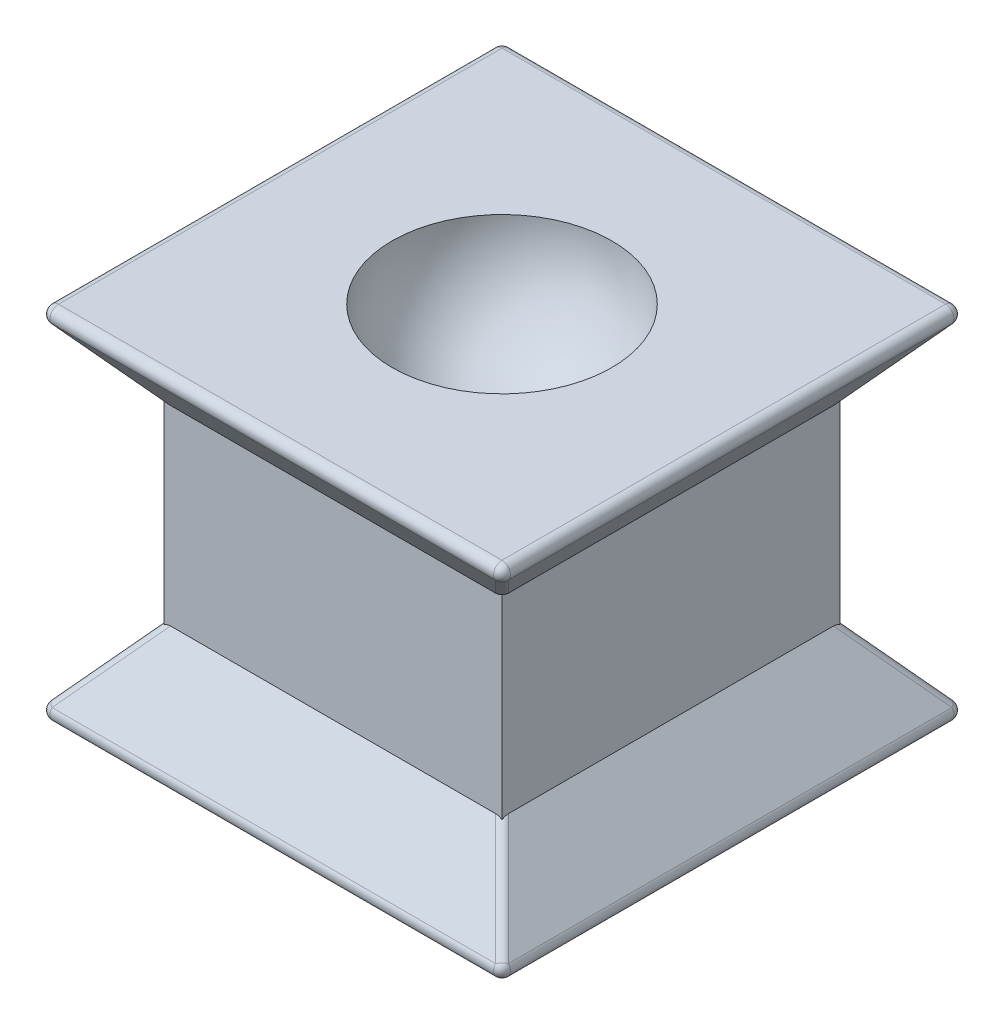
ISO-10303-21;
HEADER;
FILE_DESCRIPTION(('STEP AP214'),'2;1');
FILE_NAME('part.step','',(''),(''),'','','');
FILE_SCHEMA(('AUTOMOTIVE_DESIGN { 1 0 10303 214 1 1 1 1 }'));
ENDSEC;
DATA;
#1=APPLICATION_CONTEXT('core data for automotive mechanical design processes');
#2=APPLICATION_PROTOCOL_DEFINITION('international standard','automotive_design',2000,#1);
#3=PRODUCT_CONTEXT('',#1,'mechanical');
#4=PRODUCT('Part','Part','',(#3));
#5=PRODUCT_RELATED_PRODUCT_CATEGORY('part','',(#4));
#6=PRODUCT_DEFINITION_FORMATION('','',#4);
#7=PRODUCT_DEFINITION_CONTEXT('part definition',#1,'design');
#8=PRODUCT_DEFINITION('design','',#6,#7);
#9=PRODUCT_DEFINITION_SHAPE('','',#8);
#10=(LENGTH_UNIT() NAMED_UNIT(*) SI_UNIT(.MILLI.,.METRE.));
#11=(NAMED_UNIT(*) PLANE_ANGLE_UNIT() SI_UNIT($,.RADIAN.));
#12=(NAMED_UNIT(*) SI_UNIT($,.STERADIAN.) SOLID_ANGLE_UNIT());
#13=UNCERTAINTY_MEASURE_WITH_UNIT(LENGTH_MEASURE(1.E-05),#10,'distance_accuracy_value','');
#14=(GEOMETRIC_REPRESENTATION_CONTEXT(3) GLOBAL_UNCERTAINTY_ASSIGNED_CONTEXT((#13)) GLOBAL_UNIT_ASSIGNED_CONTEXT((#10,
#11,#12)) REPRESENTATION_CONTEXT('',''));
#15=CARTESIAN_POINT('',(0.,0.,0.));
#16=DIRECTION('',(0.,0.,1.));
#17=DIRECTION('',(1.,0.,0.));
#18=AXIS2_PLACEMENT_3D('',#15,#16,#17);
#19=CARTESIAN_POINT('',(25.4,14.351,25.4));
#20=DIRECTION('',(-1.,0.,0.));
#21=DIRECTION('',(0.,0.,1.));
#22=AXIS2_PLACEMENT_3D('',#19,#20,#21);
#23=PLANE('',#22);
#24=DIRECTION('',(0.,-1.,0.));
#25=VECTOR('',#24,1.);
#26=CARTESIAN_POINT('',(25.4,14.351,25.4));
#27=LINE('',#26,#25);
#28=CARTESIAN_POINT('',(25.4,14.665961599785,25.4));
#29=VERTEX_POINT('',#28);
#30=CARTESIAN_POINT('',(25.4,-14.665961599785,25.4));
#31=VERTEX_POINT('',#30);
#32=EDGE_CURVE('E475',#29,#31,#27,.T.);
#33=ORIENTED_EDGE('',*,*,#32,.T.);
#34=CARTESIAN_POINT('',(25.4,-16.3267692601127,25.4));
#35=DIRECTION('',(-1.,0.,0.));
#36=DIRECTION('',(0.,0.766044443118977,-0.64278760968654));
#37=AXIS2_PLACEMENT_3D('',#34,#35,#36);
#38=ELLIPSE('',#37,2.34873671772857,1.27);
#39=CARTESIAN_POINT('',(25.4,-14.351,24.4271235572389));
#40=VERTEX_POINT('',#39);
#41=EDGE_CURVE('E278',#31,#40,#38,.T.);
#42=ORIENTED_EDGE('',*,*,#41,.T.);
#43=DIRECTION('',(0.,0.,-1.));
#44=VECTOR('',#43,1.);
#45=CARTESIAN_POINT('',(25.4,-14.351,25.4));
#46=LINE('',#45,#44);
#47=CARTESIAN_POINT('',(25.4,-14.351,-24.4271235572389));
#48=VERTEX_POINT('',#47);
#49=EDGE_CURVE('E219',#40,#48,#46,.T.);
#50=ORIENTED_EDGE('',*,*,#49,.T.);
#51=CARTESIAN_POINT('',(25.4,-16.3267692601127,-25.4));
#52=DIRECTION('',(-1.,0.,0.));
#53=DIRECTION('',(0.,0.766044443118977,0.64278760968654));
#54=AXIS2_PLACEMENT_3D('',#51,#52,#53);
#55=ELLIPSE('',#54,2.34873671772857,1.27);
#56=CARTESIAN_POINT('',(25.4,-14.665961599785,-25.4));
#57=VERTEX_POINT('',#56);
#58=EDGE_CURVE('E208',#48,#57,#55,.T.);
#59=ORIENTED_EDGE('',*,*,#58,.T.);
#60=DIRECTION('',(0.,-1.,0.));
#61=VECTOR('',#60,1.);
#62=CARTESIAN_POINT('',(25.4,14.351,-25.4));
#63=LINE('',#62,#61);
#64=CARTESIAN_POINT('',(25.4,14.665961599785,-25.4));
#65=VERTEX_POINT('',#64);
#66=EDGE_CURVE('E202',#65,#57,#63,.T.);
#67=ORIENTED_EDGE('',*,*,#66,.F.);
#68=CARTESIAN_POINT('',(25.4,16.3267692601127,-25.4));
#69=DIRECTION('',(-1.,0.,0.));
#70=DIRECTION('',(0.,-0.766044443118977,0.64278760968654));
#71=AXIS2_PLACEMENT_3D('',#68,#69,#70);
#72=ELLIPSE('',#71,2.34873671772857,1.27);
#73=CARTESIAN_POINT('',(25.4,14.351,-24.4271235572389));
#74=VERTEX_POINT('',#73);
#75=EDGE_CURVE('E292',#65,#74,#72,.T.);
#76=ORIENTED_EDGE('',*,*,#75,.T.);
#77=DIRECTION('',(0.,0.,-1.));
#78=VECTOR('',#77,1.);
#79=CARTESIAN_POINT('',(25.4,14.351,25.4));
#80=LINE('',#79,#78);
#81=CARTESIAN_POINT('',(25.4,14.351,24.4271235572389));
#82=VERTEX_POINT('',#81);
#83=EDGE_CURVE('E461',#82,#74,#80,.T.);
#84=ORIENTED_EDGE('',*,*,#83,.F.);
#85=CARTESIAN_POINT('',(25.4,16.3267692601127,25.4));
#86=DIRECTION('',(-1.,0.,0.));
#87=DIRECTION('',(0.,-0.766044443118977,-0.64278760968654));
#88=AXIS2_PLACEMENT_3D('',#85,#86,#87);
#89=ELLIPSE('',#88,2.34873671772857,1.27);
#90=EDGE_CURVE('E294',#82,#29,#89,.T.);
#91=ORIENTED_EDGE('',*,*,#90,.T.);
#92=EDGE_LOOP('',(#33,#42,#50,#59,#67,#76,#84,#91));
#93=FACE_BOUND('',#92,.T.);
#94=ADVANCED_FACE('F35',(#93),#23,.F.);
#95=CARTESIAN_POINT('',(-25.4,14.351,-25.4));
#96=DIRECTION('',(0.,0.,1.));
#97=DIRECTION('',(1.,0.,0.));
#98=AXIS2_PLACEMENT_3D('',#95,#96,#97);
#99=PLANE('',#98);
#100=ORIENTED_EDGE('',*,*,#66,.T.);
#101=CARTESIAN_POINT('',(25.4,-16.3267692601127,-25.4));
#102=DIRECTION('',(0.,0.,1.));
#103=DIRECTION('',(-0.64278760968654,0.766044443118977,0.));
#104=AXIS2_PLACEMENT_3D('',#101,#102,#103);
#105=ELLIPSE('',#104,2.34873671772857,1.27);
#106=CARTESIAN_POINT('',(24.4271235572389,-14.351,-25.4));
#107=VERTEX_POINT('',#106);
#108=EDGE_CURVE('E196',#57,#107,#105,.T.);
#109=ORIENTED_EDGE('',*,*,#108,.T.);
#110=DIRECTION('',(-1.,0.,0.));
#111=VECTOR('',#110,1.);
#112=CARTESIAN_POINT('',(-25.4,-14.351,-25.4));
#113=LINE('',#112,#111);
#114=CARTESIAN_POINT('',(-24.4271235572389,-14.351,-25.4));
#115=VERTEX_POINT('',#114);
#116=EDGE_CURVE('E200',#107,#115,#113,.T.);
#117=ORIENTED_EDGE('',*,*,#116,.T.);
#118=CARTESIAN_POINT('',(-25.4,-16.3267692601127,-25.4));
#119=DIRECTION('',(0.,0.,1.));
#120=DIRECTION('',(0.64278760968654,0.766044443118977,0.));
#121=AXIS2_PLACEMENT_3D('',#118,#119,#120);
#122=ELLIPSE('',#121,2.34873671772857,1.27);
#123=CARTESIAN_POINT('',(-25.4,-14.665961599785,-25.4));
#124=VERTEX_POINT('',#123);
#125=EDGE_CURVE('E266',#115,#124,#122,.T.);
#126=ORIENTED_EDGE('',*,*,#125,.T.);
#127=DIRECTION('',(0.,-1.,0.));
#128=VECTOR('',#127,1.);
#129=CARTESIAN_POINT('',(-25.4,14.351,-25.4));
#130=LINE('',#129,#128);
#131=CARTESIAN_POINT('',(-25.4,14.665961599785,-25.4));
#132=VERTEX_POINT('',#131);
#133=EDGE_CURVE('E228',#132,#124,#130,.T.);
#134=ORIENTED_EDGE('',*,*,#133,.F.);
#135=CARTESIAN_POINT('',(-25.4,16.3267692601127,-25.4));
#136=DIRECTION('',(0.,0.,1.));
#137=DIRECTION('',(0.64278760968654,-0.766044443118977,0.));
#138=AXIS2_PLACEMENT_3D('',#135,#136,#137);
#139=ELLIPSE('',#138,2.34873671772857,1.27);
#140=CARTESIAN_POINT('',(-24.4271235572389,14.351,-25.4));
#141=VERTEX_POINT('',#140);
#142=EDGE_CURVE('E283',#132,#141,#139,.T.);
#143=ORIENTED_EDGE('',*,*,#142,.T.);
#144=DIRECTION('',(-1.,0.,0.));
#145=VECTOR('',#144,1.);
#146=CARTESIAN_POINT('',(-25.4,14.351,-25.4));
#147=LINE('',#146,#145);
#148=CARTESIAN_POINT('',(24.4271235572389,14.351,-25.4));
#149=VERTEX_POINT('',#148);
#150=EDGE_CURVE('E422',#149,#141,#147,.T.);
#151=ORIENTED_EDGE('',*,*,#150,.F.);
#152=CARTESIAN_POINT('',(25.4,16.3267692601127,-25.4));
#153=DIRECTION('',(0.,0.,1.));
#154=DIRECTION('',(-0.64278760968654,-0.766044443118977,0.));
#155=AXIS2_PLACEMENT_3D('',#152,#153,#154);
#156=ELLIPSE('',#155,2.34873671772857,1.27);
#157=EDGE_CURVE('E290',#149,#65,#156,.T.);
#158=ORIENTED_EDGE('',*,*,#157,.T.);
#159=EDGE_LOOP('',(#100,#109,#117,#126,#134,#143,#151,#158));
#160=FACE_BOUND('',#159,.T.);
#161=ADVANCED_FACE('F198',(#160),#99,.F.);
#162=CARTESIAN_POINT('',(-25.4,14.351,25.4));
#163=DIRECTION('',(1.,0.,0.));
#164=DIRECTION('',(0.,0.,-1.));
#165=AXIS2_PLACEMENT_3D('',#162,#163,#164);
#166=PLANE('',#165);
#167=ORIENTED_EDGE('',*,*,#133,.T.);
#168=CARTESIAN_POINT('',(-25.4,-16.3267692601127,-25.4));
#169=DIRECTION('',(1.,0.,0.));
#170=DIRECTION('',(0.,0.766044443118977,0.64278760968654));
#171=AXIS2_PLACEMENT_3D('',#168,#169,#170);
#172=ELLIPSE('',#171,2.34873671772857,1.27);
#173=CARTESIAN_POINT('',(-25.4,-14.351,-24.4271235572389));
#174=VERTEX_POINT('',#173);
#175=EDGE_CURVE('E268',#124,#174,#172,.T.);
#176=ORIENTED_EDGE('',*,*,#175,.T.);
#177=DIRECTION('',(0.,0.,1.));
#178=VECTOR('',#177,1.);
#179=CARTESIAN_POINT('',(-25.4,-14.351,25.4));
#180=LINE('',#179,#178);
#181=CARTESIAN_POINT('',(-25.4,-14.351,24.4271235572389));
#182=VERTEX_POINT('',#181);
#183=EDGE_CURVE('E218',#174,#182,#180,.T.);
#184=ORIENTED_EDGE('',*,*,#183,.T.);
#185=CARTESIAN_POINT('',(-25.4,-16.3267692601127,25.4));
#186=DIRECTION('',(1.,0.,0.));
#187=DIRECTION('',(0.,0.766044443118977,-0.64278760968654));
#188=AXIS2_PLACEMENT_3D('',#185,#186,#187);
#189=ELLIPSE('',#188,2.34873671772857,1.27);
#190=CARTESIAN_POINT('',(-25.4,-14.665961599785,25.4));
#191=VERTEX_POINT('',#190);
#192=EDGE_CURVE('E207',#182,#191,#189,.T.);
#193=ORIENTED_EDGE('',*,*,#192,.T.);
#194=DIRECTION('',(0.,-1.,0.));
#195=VECTOR('',#194,1.);
#196=CARTESIAN_POINT('',(-25.4,14.351,25.4));
#197=LINE('',#196,#195);
#198=CARTESIAN_POINT('',(-25.4,14.665961599785,25.4));
#199=VERTEX_POINT('',#198);
#200=EDGE_CURVE('E407',#199,#191,#197,.T.);
#201=ORIENTED_EDGE('',*,*,#200,.F.);
#202=CARTESIAN_POINT('',(-25.4,16.3267692601127,25.4));
#203=DIRECTION('',(1.,0.,0.));
#204=DIRECTION('',(0.,-0.766044443118977,-0.64278760968654));
#205=AXIS2_PLACEMENT_3D('',#202,#203,#204);
#206=ELLIPSE('',#205,2.34873671772857,1.27);
#207=CARTESIAN_POINT('',(-25.4,14.351,24.4271235572389));
#208=VERTEX_POINT('',#207);
#209=EDGE_CURVE('E288',#199,#208,#206,.T.);
#210=ORIENTED_EDGE('',*,*,#209,.T.);
#211=DIRECTION('',(0.,0.,1.));
#212=VECTOR('',#211,1.);
#213=CARTESIAN_POINT('',(-25.4,14.351,25.4));
#214=LINE('',#213,#212);
#215=CARTESIAN_POINT('',(-25.4,14.351,-24.4271235572389));
#216=VERTEX_POINT('',#215);
#217=EDGE_CURVE('E412',#216,#208,#214,.T.);
#218=ORIENTED_EDGE('',*,*,#217,.F.);
#219=CARTESIAN_POINT('',(-25.4,16.3267692601127,-25.4));
#220=DIRECTION('',(1.,0.,0.));
#221=DIRECTION('',(0.,-0.766044443118977,0.64278760968654));
#222=AXIS2_PLACEMENT_3D('',#219,#220,#221);
#223=ELLIPSE('',#222,2.34873671772857,1.27);
#224=EDGE_CURVE('E280',#216,#132,#223,.T.);
#225=ORIENTED_EDGE('',*,*,#224,.T.);
#226=EDGE_LOOP('',(#167,#176,#184,#193,#201,#210,#218,#225));
#227=FACE_BOUND('',#226,.T.);
#228=ADVANCED_FACE('F410',(#227),#166,.F.);
#229=CARTESIAN_POINT('',(-25.4,14.351,25.4));
#230=DIRECTION('',(0.,0.,-1.));
#231=DIRECTION('',(-1.,0.,0.));
#232=AXIS2_PLACEMENT_3D('',#229,#230,#231);
#233=PLANE('',#232);
#234=ORIENTED_EDGE('',*,*,#200,.T.);
#235=CARTESIAN_POINT('',(-25.4,-16.3267692601127,25.4));
#236=DIRECTION('',(0.,0.,-1.));
#237=DIRECTION('',(0.64278760968654,0.766044443118977,0.));
#238=AXIS2_PLACEMENT_3D('',#235,#236,#237);
#239=ELLIPSE('',#238,2.34873671772857,1.27);
#240=CARTESIAN_POINT('',(-24.4271235572389,-14.351,25.4));
#241=VERTEX_POINT('',#240);
#242=EDGE_CURVE('E273',#191,#241,#239,.T.);
#243=ORIENTED_EDGE('',*,*,#242,.T.);
#244=DIRECTION('',(1.,0.,0.));
#245=VECTOR('',#244,1.);
#246=CARTESIAN_POINT('',(-25.4,-14.351,25.4));
#247=LINE('',#246,#245);
#248=CARTESIAN_POINT('',(24.4271235572389,-14.351,25.4));
#249=VERTEX_POINT('',#248);
#250=EDGE_CURVE('E464',#241,#249,#247,.T.);
#251=ORIENTED_EDGE('',*,*,#250,.T.);
#252=CARTESIAN_POINT('',(25.4,-16.3267692601127,25.4));
#253=DIRECTION('',(0.,0.,-1.));
#254=DIRECTION('',(-0.64278760968654,0.766044443118977,0.));
#255=AXIS2_PLACEMENT_3D('',#252,#253,#254);
#256=ELLIPSE('',#255,2.34873671772857,1.27);
#257=EDGE_CURVE('E275',#249,#31,#256,.T.);
#258=ORIENTED_EDGE('',*,*,#257,.T.);
#259=ORIENTED_EDGE('',*,*,#32,.F.);
#260=CARTESIAN_POINT('',(25.4,16.3267692601127,25.4));
#261=DIRECTION('',(0.,0.,-1.));
#262=DIRECTION('',(-0.64278760968654,-0.766044443118977,0.));
#263=AXIS2_PLACEMENT_3D('',#260,#261,#262);
#264=ELLIPSE('',#263,2.34873671772857,1.27);
#265=CARTESIAN_POINT('',(24.4271235572389,14.351,25.4));
#266=VERTEX_POINT('',#265);
#267=EDGE_CURVE('E297',#29,#266,#264,.T.);
#268=ORIENTED_EDGE('',*,*,#267,.T.);
#269=DIRECTION('',(1.,0.,0.));
#270=VECTOR('',#269,1.);
#271=CARTESIAN_POINT('',(-25.4,14.351,25.4));
#272=LINE('',#271,#270);
#273=CARTESIAN_POINT('',(-24.4271235572389,14.351,25.4));
#274=VERTEX_POINT('',#273);
#275=EDGE_CURVE('E472',#274,#266,#272,.T.);
#276=ORIENTED_EDGE('',*,*,#275,.F.);
#277=CARTESIAN_POINT('',(-25.4,16.3267692601127,25.4));
#278=DIRECTION('',(0.,0.,-1.));
#279=DIRECTION('',(0.64278760968654,-0.766044443118977,0.));
#280=AXIS2_PLACEMENT_3D('',#277,#278,#279);
#281=ELLIPSE('',#280,2.34873671772857,1.27);
#282=EDGE_CURVE('E285',#274,#199,#281,.T.);
#283=ORIENTED_EDGE('',*,*,#282,.T.);
#284=EDGE_LOOP('',(#234,#243,#251,#258,#259,#268,#276,#283));
#285=FACE_BOUND('',#284,.T.);
#286=ADVANCED_FACE('F482',(#285),#233,.F.);
#287=CARTESIAN_POINT('',(-25.4,14.351,-25.4));
#288=DIRECTION('',(-0.766044443118977,-0.64278760968654,0.));
#289=DIRECTION('',(0.64278760968654,-0.766044443118977,0.));
#290=AXIS2_PLACEMENT_3D('',#287,#288,#289);
#291=PLANE('',#290);
#292=DIRECTION('',(-0.540716203060937,0.644400477571771,0.540716203060937));
#293=VECTOR('',#292,1.);
#294=CARTESIAN_POINT('',(-10.8318439665622,-3.01065229032249,9.85896752380108));
#295=LINE('',#294,#293);
#296=CARTESIAN_POINT('',(-34.3059179696654,24.9646597356981,33.3330415269043));
#297=VERTEX_POINT('',#296);
#298=EDGE_CURVE('E246',#208,#297,#295,.T.);
#299=ORIENTED_EDGE('',*,*,#298,.T.);
#300=DIRECTION('',(0.,0.,1.));
#301=VECTOR('',#300,1.);
#302=CARTESIAN_POINT('',(-34.3059179696654,24.9646597356981,-35.0836888731904));
#303=LINE('',#302,#301);
#304=CARTESIAN_POINT('',(-34.3059179696654,24.9646597356981,-33.3330415269043));
#305=VERTEX_POINT('',#304);
#306=EDGE_CURVE('E44',#297,#305,#303,.F.);
#307=ORIENTED_EDGE('',*,*,#306,.T.);
#308=DIRECTION('',(-0.540716203060937,0.644400477571771,-0.540716203060937));
#309=VECTOR('',#308,1.);
#310=CARTESIAN_POINT('',(-25.6844437889961,14.6899869074273,-24.711567346235));
#311=LINE('',#310,#309);
#312=EDGE_CURVE('E249',#305,#216,#311,.F.);
#313=ORIENTED_EDGE('',*,*,#312,.T.);
#314=ORIENTED_EDGE('',*,*,#217,.T.);
#315=EDGE_LOOP('',(#299,#307,#313,#314));
#316=FACE_BOUND('',#315,.T.);
#317=ADVANCED_FACE('F713',(#316),#291,.T.);
#318=CARTESIAN_POINT('',(-25.4,14.351,25.4));
#319=DIRECTION('',(0.,-0.64278760968654,0.766044443118977));
#320=DIRECTION('',(0.,-0.766044443118977,-0.64278760968654));
#321=AXIS2_PLACEMENT_3D('',#318,#319,#320);
#322=PLANE('',#321);
#323=DIRECTION('',(0.540716203060937,0.644400477571771,0.540716203060937));
#324=VECTOR('',#323,1.);
#325=CARTESIAN_POINT('',(9.85896752380108,-3.01065229032249,10.8318439665622));
#326=LINE('',#325,#324);
#327=CARTESIAN_POINT('',(33.3330415269043,24.9646597356981,34.3059179696654));
#328=VERTEX_POINT('',#327);
#329=EDGE_CURVE('E256',#266,#328,#326,.T.);
#330=ORIENTED_EDGE('',*,*,#329,.T.);
#331=DIRECTION('',(1.,0.,0.));
#332=VECTOR('',#331,1.);
#333=CARTESIAN_POINT('',(-35.0836888731904,24.9646597356981,34.3059179696654));
#334=LINE('',#333,#332);
#335=CARTESIAN_POINT('',(-33.3330415269043,24.9646597356981,34.3059179696654));
#336=VERTEX_POINT('',#335);
#337=EDGE_CURVE('E11',#328,#336,#334,.F.);
#338=ORIENTED_EDGE('',*,*,#337,.T.);
#339=DIRECTION('',(-0.540716203060937,0.644400477571771,0.540716203060938));
#340=VECTOR('',#339,1.);
#341=CARTESIAN_POINT('',(-24.711567346235,14.6899869074273,25.6844437889961));
#342=LINE('',#341,#340);
#343=EDGE_CURVE('E259',#336,#274,#342,.F.);
#344=ORIENTED_EDGE('',*,*,#343,.T.);
#345=ORIENTED_EDGE('',*,*,#275,.T.);
#346=EDGE_LOOP('',(#330,#338,#344,#345));
#347=FACE_BOUND('',#346,.T.);
#348=ADVANCED_FACE('F704',(#347),#322,.T.);
#349=CARTESIAN_POINT('',(25.4,14.351,-25.4));
#350=DIRECTION('',(0.766044443118977,-0.64278760968654,0.));
#351=DIRECTION('',(0.64278760968654,0.766044443118977,0.));
#352=AXIS2_PLACEMENT_3D('',#349,#350,#351);
#353=PLANE('',#352);
#354=DIRECTION('',(0.540716203060937,0.644400477571771,-0.540716203060937));
#355=VECTOR('',#354,1.);
#356=CARTESIAN_POINT('',(25.6844437889961,14.6899869074273,-24.711567346235));
#357=LINE('',#356,#355);
#358=CARTESIAN_POINT('',(34.3059179696654,24.9646597356981,-33.3330415269043));
#359=VERTEX_POINT('',#358);
#360=EDGE_CURVE('E263',#74,#359,#357,.T.);
#361=ORIENTED_EDGE('',*,*,#360,.T.);
#362=DIRECTION('',(0.,0.,-1.));
#363=VECTOR('',#362,1.);
#364=CARTESIAN_POINT('',(34.3059179696655,24.9646597356981,35.0836888731904));
#365=LINE('',#364,#363);
#366=CARTESIAN_POINT('',(34.3059179696655,24.9646597356981,33.3330415269043));
#367=VERTEX_POINT('',#366);
#368=EDGE_CURVE('E340',#359,#367,#365,.F.);
#369=ORIENTED_EDGE('',*,*,#368,.T.);
#370=DIRECTION('',(0.540716203060937,0.644400477571771,0.540716203060937));
#371=VECTOR('',#370,1.);
#372=CARTESIAN_POINT('',(10.8318439665622,-3.01065229032249,9.85896752380108));
#373=LINE('',#372,#371);
#374=EDGE_CURVE('E261',#367,#82,#373,.F.);
#375=ORIENTED_EDGE('',*,*,#374,.T.);
#376=ORIENTED_EDGE('',*,*,#83,.T.);
#377=EDGE_LOOP('',(#361,#369,#375,#376));
#378=FACE_BOUND('',#377,.T.);
#379=ADVANCED_FACE('F458',(#378),#353,.T.);
#380=CARTESIAN_POINT('',(-25.4,14.351,-25.4));
#381=DIRECTION('',(0.,-0.64278760968654,-0.766044443118977));
#382=DIRECTION('',(0.,0.766044443118977,-0.64278760968654));
#383=AXIS2_PLACEMENT_3D('',#380,#381,#382);
#384=PLANE('',#383);
#385=DIRECTION('',(-0.540716203060937,0.644400477571771,-0.540716203060937));
#386=VECTOR('',#385,1.);
#387=CARTESIAN_POINT('',(-24.711567346235,14.6899869074273,-25.6844437889961));
#388=LINE('',#387,#386);
#389=CARTESIAN_POINT('',(-33.3330415269043,24.9646597356981,-34.3059179696654));
#390=VERTEX_POINT('',#389);
#391=EDGE_CURVE('E253',#141,#390,#388,.T.);
#392=ORIENTED_EDGE('',*,*,#391,.T.);
#393=DIRECTION('',(-1.,0.,0.));
#394=VECTOR('',#393,1.);
#395=CARTESIAN_POINT('',(35.0836888731904,24.9646597356981,-34.3059179696654));
#396=LINE('',#395,#394);
#397=CARTESIAN_POINT('',(33.3330415269043,24.9646597356981,-34.3059179696655));
#398=VERTEX_POINT('',#397);
#399=EDGE_CURVE('E342',#390,#398,#396,.F.);
#400=ORIENTED_EDGE('',*,*,#399,.T.);
#401=DIRECTION('',(0.540716203060937,0.644400477571771,-0.540716203060938));
#402=VECTOR('',#401,1.);
#403=CARTESIAN_POINT('',(9.85896752380107,-3.01065229032248,-10.8318439665622));
#404=LINE('',#403,#402);
#405=EDGE_CURVE('E251',#398,#149,#404,.F.);
#406=ORIENTED_EDGE('',*,*,#405,.T.);
#407=ORIENTED_EDGE('',*,*,#150,.T.);
#408=EDGE_LOOP('',(#392,#400,#406,#407));
#409=FACE_BOUND('',#408,.T.);
#410=ADVANCED_FACE('F420',(#409),#384,.T.);
#411=CARTESIAN_POINT('',(0.,27.051,0.));
#412=DIRECTION('',(0.,1.,0.));
#413=DIRECTION('',(0.,0.,1.));
#414=AXIS2_PLACEMENT_3D('',#411,#412,#413);
#415=PLANE('',#414);
#416=CARTESIAN_POINT('',(0.,27.051,0.));
#417=DIRECTION('',(0.,1.,0.));
#418=DIRECTION('',(0.,0.,1.));
#419=AXIS2_PLACEMENT_3D('',#416,#417,#418);
#420=CIRCLE('',#419,16.51);
#421=CARTESIAN_POINT('',(0.,27.051,16.51));
#422=VERTEX_POINT('',#421);
#423=EDGE_CURVE('E370',#422,#422,#420,.T.);
#424=ORIENTED_EDGE('',*,*,#423,.F.);
#425=EDGE_LOOP('',(#424));
#426=FACE_BOUND('',#425,.T.);
#427=DIRECTION('',(-1.,0.,0.));
#428=VECTOR('',#427,1.);
#429=CARTESIAN_POINT('',(35.0836888731904,27.051,33.3330415269043));
#430=LINE('',#429,#428);
#431=CARTESIAN_POINT('',(-33.3330415269043,27.051,33.3330415269043));
#432=VERTEX_POINT('',#431);
#433=CARTESIAN_POINT('',(33.3330415269043,27.051,33.3330415269043));
#434=VERTEX_POINT('',#433);
#435=EDGE_CURVE('E333',#432,#434,#430,.F.);
#436=ORIENTED_EDGE('',*,*,#435,.T.);
#437=DIRECTION('',(0.,0.,1.));
#438=VECTOR('',#437,1.);
#439=CARTESIAN_POINT('',(33.3330415269043,27.051,-35.0836888731904));
#440=LINE('',#439,#438);
#441=CARTESIAN_POINT('',(33.3330415269043,27.051,-33.3330415269043));
#442=VERTEX_POINT('',#441);
#443=EDGE_CURVE('E338',#434,#442,#440,.F.);
#444=ORIENTED_EDGE('',*,*,#443,.T.);
#445=DIRECTION('',(1.,0.,0.));
#446=VECTOR('',#445,1.);
#447=CARTESIAN_POINT('',(-35.0836888731904,27.051,-33.3330415269043));
#448=LINE('',#447,#446);
#449=CARTESIAN_POINT('',(-33.3330415269043,27.051,-33.3330415269043));
#450=VERTEX_POINT('',#449);
#451=EDGE_CURVE('E52',#442,#450,#448,.F.);
#452=ORIENTED_EDGE('',*,*,#451,.T.);
#453=DIRECTION('',(0.,0.,-1.));
#454=VECTOR('',#453,1.);
#455=CARTESIAN_POINT('',(-33.3330415269043,27.051,35.0836888731904));
#456=LINE('',#455,#454);
#457=EDGE_CURVE('E335',#450,#432,#456,.F.);
#458=ORIENTED_EDGE('',*,*,#457,.T.);
#459=EDGE_LOOP('',(#436,#444,#452,#458));
#460=FACE_BOUND('',#459,.T.);
#461=ADVANCED_FACE('F433',(#426,#460),#415,.T.);
#462=CARTESIAN_POINT('',(-25.4,-14.351,-25.4));
#463=DIRECTION('',(-0.766044443118977,0.64278760968654,0.));
#464=DIRECTION('',(-0.64278760968654,-0.766044443118977,0.));
#465=AXIS2_PLACEMENT_3D('',#462,#463,#464);
#466=PLANE('',#465);
#467=DIRECTION('',(0.540716203060937,0.644400477571771,0.540716203060937));
#468=VECTOR('',#467,1.);
#469=CARTESIAN_POINT('',(-25.6844437889961,-14.6899869074273,-24.711567346235));
#470=LINE('',#469,#468);
#471=CARTESIAN_POINT('',(-34.3059179696655,-24.9646597356981,-33.3330415269043));
#472=VERTEX_POINT('',#471);
#473=EDGE_CURVE('E233',#174,#472,#470,.F.);
#474=ORIENTED_EDGE('',*,*,#473,.T.);
#475=DIRECTION('',(0.,0.,1.));
#476=VECTOR('',#475,1.);
#477=CARTESIAN_POINT('',(-34.3059179696655,-24.9646597356981,-25.4));
#478=LINE('',#477,#476);
#479=CARTESIAN_POINT('',(-34.3059179696654,-24.9646597356981,33.3330415269043));
#480=VERTEX_POINT('',#479);
#481=EDGE_CURVE('E331',#472,#480,#478,.T.);
#482=ORIENTED_EDGE('',*,*,#481,.T.);
#483=DIRECTION('',(0.540716203060937,0.644400477571771,-0.540716203060937));
#484=VECTOR('',#483,1.);
#485=CARTESIAN_POINT('',(-10.8318439665622,3.01065229032249,9.85896752380109));
#486=LINE('',#485,#484);
#487=EDGE_CURVE('E226',#480,#182,#486,.T.);
#488=ORIENTED_EDGE('',*,*,#487,.T.);
#489=ORIENTED_EDGE('',*,*,#183,.F.);
#490=EDGE_LOOP('',(#474,#482,#488,#489));
#491=FACE_BOUND('',#490,.T.);
#492=ADVANCED_FACE('F515',(#491),#466,.T.);
#493=CARTESIAN_POINT('',(-25.4,-14.351,-25.4));
#494=DIRECTION('',(0.,0.64278760968654,-0.766044443118977));
#495=DIRECTION('',(0.,0.766044443118977,0.64278760968654));
#496=AXIS2_PLACEMENT_3D('',#493,#494,#495);
#497=PLANE('',#496);
#498=DIRECTION('',(-0.540716203060937,0.644400477571771,0.540716203060938));
#499=VECTOR('',#498,1.);
#500=CARTESIAN_POINT('',(9.85896752380108,3.01065229032248,-10.8318439665622));
#501=LINE('',#500,#499);
#502=CARTESIAN_POINT('',(33.3330415269043,-24.9646597356981,-34.3059179696655));
#503=VERTEX_POINT('',#502);
#504=EDGE_CURVE('E213',#107,#503,#501,.F.);
#505=ORIENTED_EDGE('',*,*,#504,.T.);
#506=DIRECTION('',(-1.,0.,0.));
#507=VECTOR('',#506,1.);
#508=CARTESIAN_POINT('',(-25.4,-24.9646597356981,-34.3059179696654));
#509=LINE('',#508,#507);
#510=CARTESIAN_POINT('',(-33.3330415269043,-24.9646597356981,-34.3059179696654));
#511=VERTEX_POINT('',#510);
#512=EDGE_CURVE('E327',#503,#511,#509,.T.);
#513=ORIENTED_EDGE('',*,*,#512,.T.);
#514=DIRECTION('',(0.540716203060937,0.644400477571771,0.540716203060937));
#515=VECTOR('',#514,1.);
#516=CARTESIAN_POINT('',(-24.711567346235,-14.6899869074273,-25.6844437889961));
#517=LINE('',#516,#515);
#518=EDGE_CURVE('E216',#511,#115,#517,.T.);
#519=ORIENTED_EDGE('',*,*,#518,.T.);
#520=ORIENTED_EDGE('',*,*,#116,.F.);
#521=EDGE_LOOP('',(#505,#513,#519,#520));
#522=FACE_BOUND('',#521,.T.);
#523=ADVANCED_FACE('F212',(#522),#497,.T.);
#524=CARTESIAN_POINT('',(25.4,-14.351,-25.4));
#525=DIRECTION('',(0.766044443118977,0.64278760968654,0.));
#526=DIRECTION('',(-0.64278760968654,0.766044443118977,0.));
#527=AXIS2_PLACEMENT_3D('',#524,#525,#526);
#528=PLANE('',#527);
#529=DIRECTION('',(-0.540716203060937,0.644400477571771,-0.540716203060937));
#530=VECTOR('',#529,1.);
#531=CARTESIAN_POINT('',(10.8318439665622,3.01065229032249,9.85896752380108));
#532=LINE('',#531,#530);
#533=CARTESIAN_POINT('',(34.3059179696655,-24.9646597356981,33.3330415269043));
#534=VERTEX_POINT('',#533);
#535=EDGE_CURVE('E236',#40,#534,#532,.F.);
#536=ORIENTED_EDGE('',*,*,#535,.T.);
#537=DIRECTION('',(0.,0.,-1.));
#538=VECTOR('',#537,1.);
#539=CARTESIAN_POINT('',(34.3059179696655,-24.9646597356981,-25.4));
#540=LINE('',#539,#538);
#541=CARTESIAN_POINT('',(34.3059179696654,-24.9646597356981,-33.3330415269043));
#542=VERTEX_POINT('',#541);
#543=EDGE_CURVE('E324',#534,#542,#540,.T.);
#544=ORIENTED_EDGE('',*,*,#543,.T.);
#545=DIRECTION('',(-0.540716203060937,0.644400477571771,0.540716203060937));
#546=VECTOR('',#545,1.);
#547=CARTESIAN_POINT('',(25.6844437889961,-14.6899869074273,-24.711567346235));
#548=LINE('',#547,#546);
#549=EDGE_CURVE('E239',#542,#48,#548,.T.);
#550=ORIENTED_EDGE('',*,*,#549,.T.);
#551=ORIENTED_EDGE('',*,*,#49,.F.);
#552=EDGE_LOOP('',(#536,#544,#550,#551));
#553=FACE_BOUND('',#552,.T.);
#554=ADVANCED_FACE('F506',(#553),#528,.T.);
#555=CARTESIAN_POINT('',(-25.4,-14.351,25.4));
#556=DIRECTION('',(0.,0.64278760968654,0.766044443118977));
#557=DIRECTION('',(0.,-0.766044443118977,0.64278760968654));
#558=AXIS2_PLACEMENT_3D('',#555,#556,#557);
#559=PLANE('',#558);
#560=DIRECTION('',(0.540716203060937,0.644400477571771,-0.540716203060938));
#561=VECTOR('',#560,1.);
#562=CARTESIAN_POINT('',(-24.711567346235,-14.6899869074273,25.6844437889961));
#563=LINE('',#562,#561);
#564=CARTESIAN_POINT('',(-33.3330415269043,-24.9646597356981,34.3059179696654));
#565=VERTEX_POINT('',#564);
#566=EDGE_CURVE('E243',#241,#565,#563,.F.);
#567=ORIENTED_EDGE('',*,*,#566,.T.);
#568=DIRECTION('',(1.,0.,0.));
#569=VECTOR('',#568,1.);
#570=CARTESIAN_POINT('',(-25.4,-24.9646597356981,34.3059179696654));
#571=LINE('',#570,#569);
#572=CARTESIAN_POINT('',(33.3330415269044,-24.9646597356981,34.3059179696655));
#573=VERTEX_POINT('',#572);
#574=EDGE_CURVE('E311',#565,#573,#571,.T.);
#575=ORIENTED_EDGE('',*,*,#574,.T.);
#576=DIRECTION('',(-0.540716203060937,0.644400477571771,-0.540716203060937));
#577=VECTOR('',#576,1.);
#578=CARTESIAN_POINT('',(9.85896752380109,3.01065229032249,10.8318439665622));
#579=LINE('',#578,#577);
#580=EDGE_CURVE('E241',#573,#249,#579,.T.);
#581=ORIENTED_EDGE('',*,*,#580,.T.);
#582=ORIENTED_EDGE('',*,*,#250,.F.);
#583=EDGE_LOOP('',(#567,#575,#581,#582));
#584=FACE_BOUND('',#583,.T.);
#585=ADVANCED_FACE('F496',(#584),#559,.T.);
#586=CARTESIAN_POINT('',(0.,-27.051,0.));
#587=DIRECTION('',(0.,-1.,0.));
#588=DIRECTION('',(0.,0.,1.));
#589=AXIS2_PLACEMENT_3D('',#586,#587,#588);
#590=PLANE('',#589);
#591=DIRECTION('',(0.,0.,-1.));
#592=VECTOR('',#591,1.);
#593=CARTESIAN_POINT('',(33.3330415269043,-27.051,0.));
#594=LINE('',#593,#592);
#595=CARTESIAN_POINT('',(33.3330415269043,-27.051,-33.3330415269043));
#596=VERTEX_POINT('',#595);
#597=CARTESIAN_POINT('',(33.3330415269044,-27.051,33.3330415269043));
#598=VERTEX_POINT('',#597);
#599=EDGE_CURVE('E317',#596,#598,#594,.F.);
#600=ORIENTED_EDGE('',*,*,#599,.T.);
#601=DIRECTION('',(1.,0.,0.));
#602=VECTOR('',#601,1.);
#603=CARTESIAN_POINT('',(0.,-27.051,33.3330415269043));
#604=LINE('',#603,#602);
#605=CARTESIAN_POINT('',(-33.3330415269043,-27.051,33.3330415269043));
#606=VERTEX_POINT('',#605);
#607=EDGE_CURVE('E319',#598,#606,#604,.F.);
#608=ORIENTED_EDGE('',*,*,#607,.T.);
#609=DIRECTION('',(0.,0.,1.));
#610=VECTOR('',#609,1.);
#611=CARTESIAN_POINT('',(-33.3330415269043,-27.051,0.));
#612=LINE('',#611,#610);
#613=CARTESIAN_POINT('',(-33.3330415269043,-27.051,-33.3330415269043));
#614=VERTEX_POINT('',#613);
#615=EDGE_CURVE('E313',#606,#614,#612,.F.);
#616=ORIENTED_EDGE('',*,*,#615,.T.);
#617=DIRECTION('',(-1.,0.,0.));
#618=VECTOR('',#617,1.);
#619=CARTESIAN_POINT('',(0.,-27.051,-33.3330415269043));
#620=LINE('',#619,#618);
#621=EDGE_CURVE('E315',#614,#596,#620,.F.);
#622=ORIENTED_EDGE('',*,*,#621,.T.);
#623=EDGE_LOOP('',(#600,#608,#616,#622));
#624=FACE_BOUND('',#623,.T.);
#625=ADVANCED_FACE('F513',(#624),#590,.T.);
#626=CARTESIAN_POINT('',(-24.711567346235,-15.5063271717292,-24.711567346235));
#627=DIRECTION('',(0.540716203060938,0.644400477571771,0.540716203060937));
#628=DIRECTION('',(-0.766044443118977,0.64278760968654,0.));
#629=AXIS2_PLACEMENT_3D('',#626,#627,#628);
#630=CYLINDRICAL_SURFACE('',#629,1.27);
#631=ORIENTED_EDGE('',*,*,#518,.F.);
#632=CARTESIAN_POINT('',(-33.3330415269043,-25.781,-33.3330415269043));
#633=DIRECTION('',(0.540716203060938,0.644400477571771,0.540716203060937));
#634=DIRECTION('',(-0.766044443118977,0.64278760968654,0.));
#635=AXIS2_PLACEMENT_3D('',#632,#633,#634);
#636=CIRCLE('',#635,1.27);
#637=EDGE_CURVE('E329',#511,#472,#636,.T.);
#638=ORIENTED_EDGE('',*,*,#637,.T.);
#639=ORIENTED_EDGE('',*,*,#473,.F.);
#640=ORIENTED_EDGE('',*,*,#175,.F.);
#641=ORIENTED_EDGE('',*,*,#125,.F.);
#642=EDGE_LOOP('',(#631,#638,#639,#640,#641));
#643=FACE_BOUND('',#642,.T.);
#644=ADVANCED_FACE('F400',(#643),#630,.T.);
#645=CARTESIAN_POINT('',(24.711567346235,-15.5063271717292,-24.711567346235));
#646=DIRECTION('',(-0.540716203060937,0.644400477571771,0.540716203060937));
#647=DIRECTION('',(0.,-0.64278760968654,0.766044443118977));
#648=AXIS2_PLACEMENT_3D('',#645,#646,#647);
#649=CYLINDRICAL_SURFACE('',#648,1.27);
#650=ORIENTED_EDGE('',*,*,#549,.F.);
#651=CARTESIAN_POINT('',(33.3330415269043,-25.781,-33.3330415269043));
#652=DIRECTION('',(-0.540716203060937,0.644400477571771,0.540716203060937));
#653=DIRECTION('',(0.,-0.64278760968654,0.766044443118977));
#654=AXIS2_PLACEMENT_3D('',#651,#652,#653);
#655=CIRCLE('',#654,1.27);
#656=EDGE_CURVE('E224',#542,#503,#655,.T.);
#657=ORIENTED_EDGE('',*,*,#656,.T.);
#658=ORIENTED_EDGE('',*,*,#504,.F.);
#659=ORIENTED_EDGE('',*,*,#108,.F.);
#660=ORIENTED_EDGE('',*,*,#58,.F.);
#661=EDGE_LOOP('',(#650,#657,#658,#659,#660));
#662=FACE_BOUND('',#661,.T.);
#663=ADVANCED_FACE('F222',(#662),#649,.T.);
#664=CARTESIAN_POINT('',(-9.85896752380108,2.19431202602058,9.85896752380108));
#665=DIRECTION('',(0.540716203060937,0.644400477571771,-0.540716203060937));
#666=DIRECTION('',(0.,0.64278760968654,0.766044443118977));
#667=AXIS2_PLACEMENT_3D('',#664,#665,#666);
#668=CYLINDRICAL_SURFACE('',#667,1.27);
#669=ORIENTED_EDGE('',*,*,#487,.F.);
#670=CARTESIAN_POINT('',(-33.3330415269043,-25.781,33.3330415269043));
#671=DIRECTION('',(0.540716203060937,0.644400477571771,-0.540716203060937));
#672=DIRECTION('',(0.,0.64278760968654,0.766044443118977));
#673=AXIS2_PLACEMENT_3D('',#670,#671,#672);
#674=CIRCLE('',#673,1.27);
#675=EDGE_CURVE('E308',#480,#565,#674,.T.);
#676=ORIENTED_EDGE('',*,*,#675,.T.);
#677=ORIENTED_EDGE('',*,*,#566,.F.);
#678=ORIENTED_EDGE('',*,*,#242,.F.);
#679=ORIENTED_EDGE('',*,*,#192,.F.);
#680=EDGE_LOOP('',(#669,#676,#677,#678,#679));
#681=FACE_BOUND('',#680,.T.);
#682=ADVANCED_FACE('F493',(#681),#668,.T.);
#683=CARTESIAN_POINT('',(9.85896752380109,2.19431202602059,9.85896752380108));
#684=DIRECTION('',(-0.540716203060938,0.644400477571771,-0.540716203060937));
#685=DIRECTION('',(-0.766044443118977,-0.64278760968654,0.));
#686=AXIS2_PLACEMENT_3D('',#683,#684,#685);
#687=CYLINDRICAL_SURFACE('',#686,1.27);
#688=ORIENTED_EDGE('',*,*,#580,.F.);
#689=CARTESIAN_POINT('',(33.3330415269044,-25.781,33.3330415269043));
#690=DIRECTION('',(-0.540716203060938,0.644400477571771,-0.540716203060937));
#691=DIRECTION('',(-0.766044443118977,-0.64278760968654,0.));
#692=AXIS2_PLACEMENT_3D('',#689,#690,#691);
#693=CIRCLE('',#692,1.27);
#694=EDGE_CURVE('E322',#573,#534,#693,.T.);
#695=ORIENTED_EDGE('',*,*,#694,.T.);
#696=ORIENTED_EDGE('',*,*,#535,.F.);
#697=ORIENTED_EDGE('',*,*,#41,.F.);
#698=ORIENTED_EDGE('',*,*,#257,.F.);
#699=EDGE_LOOP('',(#688,#695,#696,#697,#698));
#700=FACE_BOUND('',#699,.T.);
#701=ADVANCED_FACE('F503',(#700),#687,.T.);
#702=CARTESIAN_POINT('',(-24.711567346235,15.5063271717292,-24.711567346235));
#703=DIRECTION('',(0.540716203060938,-0.644400477571771,0.540716203060937));
#704=DIRECTION('',(0.766044443118977,0.64278760968654,0.));
#705=AXIS2_PLACEMENT_3D('',#702,#703,#704);
#706=CYLINDRICAL_SURFACE('',#705,1.27);
#707=ORIENTED_EDGE('',*,*,#312,.F.);
#708=CARTESIAN_POINT('',(-33.3330415269043,25.781,-33.3330415269043));
#709=DIRECTION('',(0.540716203060938,-0.644400477571771,0.540716203060937));
#710=DIRECTION('',(0.766044443118977,0.64278760968654,0.));
#711=AXIS2_PLACEMENT_3D('',#708,#709,#710);
#712=CIRCLE('',#711,1.27);
#713=EDGE_CURVE('E302',#305,#390,#712,.T.);
#714=ORIENTED_EDGE('',*,*,#713,.T.);
#715=ORIENTED_EDGE('',*,*,#391,.F.);
#716=ORIENTED_EDGE('',*,*,#142,.F.);
#717=ORIENTED_EDGE('',*,*,#224,.F.);
#718=EDGE_LOOP('',(#707,#714,#715,#716,#717));
#719=FACE_BOUND('',#718,.T.);
#720=ADVANCED_FACE('F416',(#719),#706,.T.);
#721=CARTESIAN_POINT('',(-24.711567346235,15.5063271717292,24.711567346235));
#722=DIRECTION('',(0.540716203060937,-0.644400477571771,-0.540716203060937));
#723=DIRECTION('',(0.,0.64278760968654,-0.766044443118977));
#724=AXIS2_PLACEMENT_3D('',#721,#722,#723);
#725=CYLINDRICAL_SURFACE('',#724,1.27);
#726=ORIENTED_EDGE('',*,*,#343,.F.);
#727=CARTESIAN_POINT('',(-33.3330415269043,25.781,33.3330415269043));
#728=DIRECTION('',(0.540716203060937,-0.644400477571771,-0.540716203060937));
#729=DIRECTION('',(0.,0.64278760968654,-0.766044443118977));
#730=AXIS2_PLACEMENT_3D('',#727,#728,#729);
#731=CIRCLE('',#730,1.27);
#732=EDGE_CURVE('E299',#336,#297,#731,.T.);
#733=ORIENTED_EDGE('',*,*,#732,.T.);
#734=ORIENTED_EDGE('',*,*,#298,.F.);
#735=ORIENTED_EDGE('',*,*,#209,.F.);
#736=ORIENTED_EDGE('',*,*,#282,.F.);
#737=EDGE_LOOP('',(#726,#733,#734,#735,#736));
#738=FACE_BOUND('',#737,.T.);
#739=ADVANCED_FACE('F535',(#738),#725,.T.);
#740=CARTESIAN_POINT('',(9.85896752380108,-2.19431202602058,-9.85896752380108));
#741=DIRECTION('',(-0.540716203060937,-0.644400477571771,0.540716203060937));
#742=DIRECTION('',(0.,-0.64278760968654,-0.766044443118977));
#743=AXIS2_PLACEMENT_3D('',#740,#741,#742);
#744=CYLINDRICAL_SURFACE('',#743,1.27);
#745=ORIENTED_EDGE('',*,*,#405,.F.);
#746=CARTESIAN_POINT('',(33.3330415269043,25.781,-33.3330415269043));
#747=DIRECTION('',(-0.540716203060937,-0.644400477571771,0.540716203060937));
#748=DIRECTION('',(0.,-0.64278760968654,-0.766044443118977));
#749=AXIS2_PLACEMENT_3D('',#746,#747,#748);
#750=CIRCLE('',#749,1.27);
#751=EDGE_CURVE('E304',#398,#359,#750,.T.);
#752=ORIENTED_EDGE('',*,*,#751,.T.);
#753=ORIENTED_EDGE('',*,*,#360,.F.);
#754=ORIENTED_EDGE('',*,*,#75,.F.);
#755=ORIENTED_EDGE('',*,*,#157,.F.);
#756=EDGE_LOOP('',(#745,#752,#753,#754,#755));
#757=FACE_BOUND('',#756,.T.);
#758=ADVANCED_FACE('F453',(#757),#744,.T.);
#759=CARTESIAN_POINT('',(9.85896752380108,-2.19431202602058,9.85896752380108));
#760=DIRECTION('',(-0.540716203060938,-0.644400477571771,-0.540716203060937));
#761=DIRECTION('',(0.766044443118977,-0.64278760968654,0.));
#762=AXIS2_PLACEMENT_3D('',#759,#760,#761);
#763=CYLINDRICAL_SURFACE('',#762,1.27);
#764=ORIENTED_EDGE('',*,*,#374,.F.);
#765=CARTESIAN_POINT('',(33.3330415269043,25.781,33.3330415269043));
#766=DIRECTION('',(-0.540716203060938,-0.644400477571771,-0.540716203060937));
#767=DIRECTION('',(0.766044443118977,-0.64278760968654,0.));
#768=AXIS2_PLACEMENT_3D('',#765,#766,#767);
#769=CIRCLE('',#768,1.27);
#770=EDGE_CURVE('E306',#367,#328,#769,.T.);
#771=ORIENTED_EDGE('',*,*,#770,.T.);
#772=ORIENTED_EDGE('',*,*,#329,.F.);
#773=ORIENTED_EDGE('',*,*,#267,.F.);
#774=ORIENTED_EDGE('',*,*,#90,.F.);
#775=EDGE_LOOP('',(#764,#771,#772,#773,#774));
#776=FACE_BOUND('',#775,.T.);
#777=ADVANCED_FACE('F541',(#776),#763,.T.);
#778=CARTESIAN_POINT('',(33.3330415269043,25.781,-33.3330415269043));
#779=DIRECTION('',(0.,1.,0.));
#780=DIRECTION('',(0.,0.,1.));
#781=AXIS2_PLACEMENT_3D('',#778,#779,#780);
#782=SPHERICAL_SURFACE('',#781,1.27);
#783=CARTESIAN_POINT('',(33.3330415269043,25.781,-33.3330415269043));
#784=DIRECTION('',(0.,0.,1.));
#785=DIRECTION('',(1.,0.,0.));
#786=AXIS2_PLACEMENT_3D('',#783,#784,#785);
#787=CIRCLE('',#786,1.27);
#788=EDGE_CURVE('E362',#359,#442,#787,.T.);
#789=ORIENTED_EDGE('',*,*,#788,.F.);
#790=ORIENTED_EDGE('',*,*,#751,.F.);
#791=CARTESIAN_POINT('',(33.3330415269043,25.781,-33.3330415269043));
#792=DIRECTION('',(-1.,0.,0.));
#793=DIRECTION('',(0.,0.,1.));
#794=AXIS2_PLACEMENT_3D('',#791,#792,#793);
#795=CIRCLE('',#794,1.27);
#796=EDGE_CURVE('E365',#442,#398,#795,.T.);
#797=ORIENTED_EDGE('',*,*,#796,.F.);
#798=EDGE_LOOP('',(#789,#790,#797));
#799=FACE_BOUND('',#798,.T.);
#800=ADVANCED_FACE('F450',(#799),#782,.T.);
#801=CARTESIAN_POINT('',(0.,25.781,-33.3330415269043));
#802=DIRECTION('',(-1.,0.,0.));
#803=DIRECTION('',(0.,0.,1.));
#804=AXIS2_PLACEMENT_3D('',#801,#802,#803);
#805=CYLINDRICAL_SURFACE('',#804,1.27);
#806=ORIENTED_EDGE('',*,*,#796,.T.);
#807=ORIENTED_EDGE('',*,*,#399,.F.);
#808=CARTESIAN_POINT('',(-33.3330415269043,25.781,-33.3330415269043));
#809=DIRECTION('',(-1.,0.,0.));
#810=DIRECTION('',(0.,0.,1.));
#811=AXIS2_PLACEMENT_3D('',#808,#809,#810);
#812=CIRCLE('',#811,1.27);
#813=EDGE_CURVE('E359',#450,#390,#812,.T.);
#814=ORIENTED_EDGE('',*,*,#813,.F.);
#815=ORIENTED_EDGE('',*,*,#451,.F.);
#816=EDGE_LOOP('',(#806,#807,#814,#815));
#817=FACE_BOUND('',#816,.T.);
#818=ADVANCED_FACE('F423',(#817),#805,.T.);
#819=CARTESIAN_POINT('',(33.3330415269043,25.781,0.));
#820=DIRECTION('',(0.,0.,-1.));
#821=DIRECTION('',(-1.,0.,0.));
#822=AXIS2_PLACEMENT_3D('',#819,#820,#821);
#823=CYLINDRICAL_SURFACE('',#822,1.27);
#824=ORIENTED_EDGE('',*,*,#788,.T.);
#825=ORIENTED_EDGE('',*,*,#443,.F.);
#826=CARTESIAN_POINT('',(33.3330415269043,25.781,33.3330415269043));
#827=DIRECTION('',(0.,0.,1.));
#828=DIRECTION('',(0.,-1.,0.));
#829=AXIS2_PLACEMENT_3D('',#826,#827,#828);
#830=CIRCLE('',#829,1.27);
#831=EDGE_CURVE('E356',#367,#434,#830,.T.);
#832=ORIENTED_EDGE('',*,*,#831,.F.);
#833=ORIENTED_EDGE('',*,*,#368,.F.);
#834=EDGE_LOOP('',(#824,#825,#832,#833));
#835=FACE_BOUND('',#834,.T.);
#836=ADVANCED_FACE('F446',(#835),#823,.T.);
#837=CARTESIAN_POINT('',(-33.3330415269043,25.781,-33.3330415269043));
#838=DIRECTION('',(0.,1.,0.));
#839=DIRECTION('',(0.,0.,1.));
#840=AXIS2_PLACEMENT_3D('',#837,#838,#839);
#841=SPHERICAL_SURFACE('',#840,1.27);
#842=ORIENTED_EDGE('',*,*,#813,.T.);
#843=ORIENTED_EDGE('',*,*,#713,.F.);
#844=CARTESIAN_POINT('',(-33.3330415269043,25.781,-33.3330415269043));
#845=DIRECTION('',(0.,0.,1.));
#846=DIRECTION('',(1.,0.,0.));
#847=AXIS2_PLACEMENT_3D('',#844,#845,#846);
#848=CIRCLE('',#847,1.27);
#849=EDGE_CURVE('E353',#450,#305,#848,.T.);
#850=ORIENTED_EDGE('',*,*,#849,.F.);
#851=EDGE_LOOP('',(#842,#843,#850));
#852=FACE_BOUND('',#851,.T.);
#853=ADVANCED_FACE('F426',(#852),#841,.T.);
#854=CARTESIAN_POINT('',(33.3330415269043,25.781,33.3330415269043));
#855=DIRECTION('',(0.,1.,0.));
#856=DIRECTION('',(0.,0.,1.));
#857=AXIS2_PLACEMENT_3D('',#854,#855,#856);
#858=SPHERICAL_SURFACE('',#857,1.27);
#859=ORIENTED_EDGE('',*,*,#770,.F.);
#860=ORIENTED_EDGE('',*,*,#831,.T.);
#861=CARTESIAN_POINT('',(33.3330415269044,25.781,33.3330415269043));
#862=DIRECTION('',(-1.,0.,0.));
#863=DIRECTION('',(0.,0.,1.));
#864=AXIS2_PLACEMENT_3D('',#861,#862,#863);
#865=CIRCLE('',#864,1.27);
#866=EDGE_CURVE('E350',#328,#434,#865,.T.);
#867=ORIENTED_EDGE('',*,*,#866,.F.);
#868=EDGE_LOOP('',(#859,#860,#867));
#869=FACE_BOUND('',#868,.T.);
#870=ADVANCED_FACE('F442',(#869),#858,.T.);
#871=CARTESIAN_POINT('',(-33.3330415269043,25.781,0.));
#872=DIRECTION('',(0.,0.,1.));
#873=DIRECTION('',(1.,0.,0.));
#874=AXIS2_PLACEMENT_3D('',#871,#872,#873);
#875=CYLINDRICAL_SURFACE('',#874,1.27);
#876=ORIENTED_EDGE('',*,*,#849,.T.);
#877=ORIENTED_EDGE('',*,*,#306,.F.);
#878=CARTESIAN_POINT('',(-33.3330415269043,25.781,33.3330415269043));
#879=DIRECTION('',(0.,0.,1.));
#880=DIRECTION('',(1.,0.,0.));
#881=AXIS2_PLACEMENT_3D('',#878,#879,#880);
#882=CIRCLE('',#881,1.27);
#883=EDGE_CURVE('E348',#432,#297,#882,.T.);
#884=ORIENTED_EDGE('',*,*,#883,.F.);
#885=ORIENTED_EDGE('',*,*,#457,.F.);
#886=EDGE_LOOP('',(#876,#877,#884,#885));
#887=FACE_BOUND('',#886,.T.);
#888=ADVANCED_FACE('F431',(#887),#875,.T.);
#889=CARTESIAN_POINT('',(0.,25.781,33.3330415269043));
#890=DIRECTION('',(1.,0.,0.));
#891=DIRECTION('',(0.,0.,-1.));
#892=AXIS2_PLACEMENT_3D('',#889,#890,#891);
#893=CYLINDRICAL_SURFACE('',#892,1.27);
#894=ORIENTED_EDGE('',*,*,#866,.T.);
#895=ORIENTED_EDGE('',*,*,#435,.F.);
#896=CARTESIAN_POINT('',(-33.3330415269043,25.781,33.3330415269043));
#897=DIRECTION('',(-1.,0.,0.));
#898=DIRECTION('',(0.,0.,1.));
#899=AXIS2_PLACEMENT_3D('',#896,#897,#898);
#900=CIRCLE('',#899,1.27);
#901=EDGE_CURVE('E345',#336,#432,#900,.T.);
#902=ORIENTED_EDGE('',*,*,#901,.F.);
#903=ORIENTED_EDGE('',*,*,#337,.F.);
#904=EDGE_LOOP('',(#894,#895,#902,#903));
#905=FACE_BOUND('',#904,.T.);
#906=ADVANCED_FACE('F437',(#905),#893,.T.);
#907=CARTESIAN_POINT('',(-33.3330415269043,25.781,33.3330415269043));
#908=DIRECTION('',(0.,1.,0.));
#909=DIRECTION('',(0.,0.,1.));
#910=AXIS2_PLACEMENT_3D('',#907,#908,#909);
#911=SPHERICAL_SURFACE('',#910,1.27);
#912=ORIENTED_EDGE('',*,*,#883,.T.);
#913=ORIENTED_EDGE('',*,*,#732,.F.);
#914=ORIENTED_EDGE('',*,*,#901,.T.);
#915=EDGE_LOOP('',(#912,#913,#914));
#916=FACE_BOUND('',#915,.T.);
#917=ADVANCED_FACE('F545',(#916),#911,.T.);
#918=CARTESIAN_POINT('',(33.3330415269043,-25.781,-33.3330415269043));
#919=DIRECTION('',(0.,-1.,0.));
#920=DIRECTION('',(0.,0.,-1.));
#921=AXIS2_PLACEMENT_3D('',#918,#919,#920);
#922=SPHERICAL_SURFACE('',#921,1.27);
#923=CARTESIAN_POINT('',(33.3330415269043,-25.781,-33.3330415269043));
#924=DIRECTION('',(-1.,0.,0.));
#925=DIRECTION('',(0.,0.,1.));
#926=AXIS2_PLACEMENT_3D('',#923,#924,#925);
#927=CIRCLE('',#926,1.27);
#928=EDGE_CURVE('E383',#503,#596,#927,.T.);
#929=ORIENTED_EDGE('',*,*,#928,.F.);
#930=ORIENTED_EDGE('',*,*,#656,.F.);
#931=CARTESIAN_POINT('',(33.3330415269043,-25.781,-33.3330415269043));
#932=DIRECTION('',(0.,0.,1.));
#933=DIRECTION('',(1.,0.,0.));
#934=AXIS2_PLACEMENT_3D('',#931,#932,#933);
#935=CIRCLE('',#934,1.27);
#936=EDGE_CURVE('E39',#596,#542,#935,.T.);
#937=ORIENTED_EDGE('',*,*,#936,.F.);
#938=EDGE_LOOP('',(#929,#930,#937));
#939=FACE_BOUND('',#938,.T.);
#940=ADVANCED_FACE('F37',(#939),#922,.T.);
#941=CARTESIAN_POINT('',(33.3330415269043,-25.781,-25.4));
#942=DIRECTION('',(0.,0.,-1.));
#943=DIRECTION('',(-1.,0.,0.));
#944=AXIS2_PLACEMENT_3D('',#941,#942,#943);
#945=CYLINDRICAL_SURFACE('',#944,1.27);
#946=ORIENTED_EDGE('',*,*,#936,.T.);
#947=ORIENTED_EDGE('',*,*,#543,.F.);
#948=CARTESIAN_POINT('',(33.3330415269044,-25.781,33.3330415269043));
#949=DIRECTION('',(0.,0.,1.));
#950=DIRECTION('',(1.,0.,0.));
#951=AXIS2_PLACEMENT_3D('',#948,#949,#950);
#952=CIRCLE('',#951,1.27);
#953=EDGE_CURVE('E381',#598,#534,#952,.T.);
#954=ORIENTED_EDGE('',*,*,#953,.F.);
#955=ORIENTED_EDGE('',*,*,#599,.F.);
#956=EDGE_LOOP('',(#946,#947,#954,#955));
#957=FACE_BOUND('',#956,.T.);
#958=ADVANCED_FACE('F393',(#957),#945,.T.);
#959=CARTESIAN_POINT('',(-25.4,-25.781,-33.3330415269043));
#960=DIRECTION('',(-1.,0.,0.));
#961=DIRECTION('',(0.,0.,1.));
#962=AXIS2_PLACEMENT_3D('',#959,#960,#961);
#963=CYLINDRICAL_SURFACE('',#962,1.27);
#964=ORIENTED_EDGE('',*,*,#928,.T.);
#965=ORIENTED_EDGE('',*,*,#621,.F.);
#966=CARTESIAN_POINT('',(-33.3330415269043,-25.781,-33.3330415269043));
#967=DIRECTION('',(-1.,0.,0.));
#968=DIRECTION('',(0.,0.,1.));
#969=AXIS2_PLACEMENT_3D('',#966,#967,#968);
#970=CIRCLE('',#969,1.27);
#971=EDGE_CURVE('E378',#511,#614,#970,.T.);
#972=ORIENTED_EDGE('',*,*,#971,.F.);
#973=ORIENTED_EDGE('',*,*,#512,.F.);
#974=EDGE_LOOP('',(#964,#965,#972,#973));
#975=FACE_BOUND('',#974,.T.);
#976=ADVANCED_FACE('F397',(#975),#963,.T.);
#977=CARTESIAN_POINT('',(33.3330415269044,-25.781,33.3330415269043));
#978=DIRECTION('',(0.,-1.,0.));
#979=DIRECTION('',(0.,0.,-1.));
#980=AXIS2_PLACEMENT_3D('',#977,#978,#979);
#981=SPHERICAL_SURFACE('',#980,1.27);
#982=ORIENTED_EDGE('',*,*,#953,.T.);
#983=ORIENTED_EDGE('',*,*,#694,.F.);
#984=CARTESIAN_POINT('',(33.3330415269044,-25.781,33.3330415269043));
#985=DIRECTION('',(-1.,0.,0.));
#986=DIRECTION('',(0.,0.,1.));
#987=AXIS2_PLACEMENT_3D('',#984,#985,#986);
#988=CIRCLE('',#987,1.27);
#989=EDGE_CURVE('E375',#598,#573,#988,.T.);
#990=ORIENTED_EDGE('',*,*,#989,.F.);
#991=EDGE_LOOP('',(#982,#983,#990));
#992=FACE_BOUND('',#991,.T.);
#993=ADVANCED_FACE('F579',(#992),#981,.T.);
#994=CARTESIAN_POINT('',(-33.3330415269043,-25.781,-33.3330415269043));
#995=DIRECTION('',(0.,-1.,0.));
#996=DIRECTION('',(0.,0.,-1.));
#997=AXIS2_PLACEMENT_3D('',#994,#995,#996);
#998=SPHERICAL_SURFACE('',#997,1.27);
#999=ORIENTED_EDGE('',*,*,#637,.F.);
#1000=ORIENTED_EDGE('',*,*,#971,.T.);
#1001=CARTESIAN_POINT('',(-33.3330415269043,-25.781,-33.3330415269043));
#1002=DIRECTION('',(0.,0.,1.));
#1003=DIRECTION('',(0.,-1.,0.));
#1004=AXIS2_PLACEMENT_3D('',#1001,#1002,#1003);
#1005=CIRCLE('',#1004,1.27);
#1006=EDGE_CURVE('E372',#472,#614,#1005,.T.);
#1007=ORIENTED_EDGE('',*,*,#1006,.F.);
#1008=EDGE_LOOP('',(#999,#1000,#1007));
#1009=FACE_BOUND('',#1008,.T.);
#1010=ADVANCED_FACE('F575',(#1009),#998,.T.);
#1011=CARTESIAN_POINT('',(-25.4,-25.781,33.3330415269043));
#1012=DIRECTION('',(1.,0.,0.));
#1013=DIRECTION('',(0.,0.,-1.));
#1014=AXIS2_PLACEMENT_3D('',#1011,#1012,#1013);
#1015=CYLINDRICAL_SURFACE('',#1014,1.27);
#1016=ORIENTED_EDGE('',*,*,#989,.T.);
#1017=ORIENTED_EDGE('',*,*,#574,.F.);
#1018=CARTESIAN_POINT('',(-33.3330415269043,-25.781,33.3330415269043));
#1019=DIRECTION('',(-1.,0.,0.));
#1020=DIRECTION('',(0.,0.,1.));
#1021=AXIS2_PLACEMENT_3D('',#1018,#1019,#1020);
#1022=CIRCLE('',#1021,1.27);
#1023=EDGE_CURVE('E369',#606,#565,#1022,.T.);
#1024=ORIENTED_EDGE('',*,*,#1023,.F.);
#1025=ORIENTED_EDGE('',*,*,#607,.F.);
#1026=EDGE_LOOP('',(#1016,#1017,#1024,#1025));
#1027=FACE_BOUND('',#1026,.T.);
#1028=ADVANCED_FACE('F571',(#1027),#1015,.T.);
#1029=CARTESIAN_POINT('',(-33.3330415269043,-25.781,-25.4));
#1030=DIRECTION('',(0.,0.,1.));
#1031=DIRECTION('',(1.,0.,0.));
#1032=AXIS2_PLACEMENT_3D('',#1029,#1030,#1031);
#1033=CYLINDRICAL_SURFACE('',#1032,1.27);
#1034=ORIENTED_EDGE('',*,*,#1006,.T.);
#1035=ORIENTED_EDGE('',*,*,#615,.F.);
#1036=CARTESIAN_POINT('',(-33.3330415269043,-25.781,33.3330415269043));
#1037=DIRECTION('',(0.,0.,1.));
#1038=DIRECTION('',(0.,-1.,0.));
#1039=AXIS2_PLACEMENT_3D('',#1036,#1037,#1038);
#1040=CIRCLE('',#1039,1.27);
#1041=EDGE_CURVE('E367',#480,#606,#1040,.T.);
#1042=ORIENTED_EDGE('',*,*,#1041,.F.);
#1043=ORIENTED_EDGE('',*,*,#481,.F.);
#1044=EDGE_LOOP('',(#1034,#1035,#1042,#1043));
#1045=FACE_BOUND('',#1044,.T.);
#1046=ADVANCED_FACE('F567',(#1045),#1033,.T.);
#1047=CARTESIAN_POINT('',(-33.3330415269043,-25.781,33.3330415269043));
#1048=DIRECTION('',(0.,-1.,0.));
#1049=DIRECTION('',(0.,0.,-1.));
#1050=AXIS2_PLACEMENT_3D('',#1047,#1048,#1049);
#1051=SPHERICAL_SURFACE('',#1050,1.27);
#1052=ORIENTED_EDGE('',*,*,#1023,.T.);
#1053=ORIENTED_EDGE('',*,*,#675,.F.);
#1054=ORIENTED_EDGE('',*,*,#1041,.T.);
#1055=EDGE_LOOP('',(#1052,#1053,#1054));
#1056=FACE_BOUND('',#1055,.T.);
#1057=ADVANCED_FACE('F563',(#1056),#1051,.T.);
#1058=CARTESIAN_POINT('',(0.,27.051,0.));
#1059=DIRECTION('',(0.,1.,0.));
#1060=DIRECTION('',(-1.,0.,0.));
#1061=AXIS2_PLACEMENT_3D('',#1058,#1059,#1060);
#1062=SPHERICAL_SURFACE('',#1061,16.51);
#1063=ORIENTED_EDGE('',*,*,#423,.T.);
#1064=EDGE_LOOP('',(#1063));
#1065=FACE_BOUND('',#1064,.T.);
#1066=ADVANCED_FACE('F566',(#1065),#1062,.F.);
#1067=CLOSED_SHELL('',(#94,#161,#228,#286,#317,#348,#379,#410,#461,#492,#523,#554,#585,#625,
#644,#663,#682,#701,#720,#739,#758,#777,#800,#818,#836,#853,#870,#888,#906,#917,#940,#958,#976,
#993,#1010,#1028,#1046,#1057,#1066));
#1068=MANIFOLD_SOLID_BREP('B2',#1067);
#1069=ADVANCED_BREP_SHAPE_REPRESENTATION('',(#18,#1068),#14);
#1070=SHAPE_DEFINITION_REPRESENTATION(#9,#1069);
ENDSEC;
END-ISO-10303-21;
